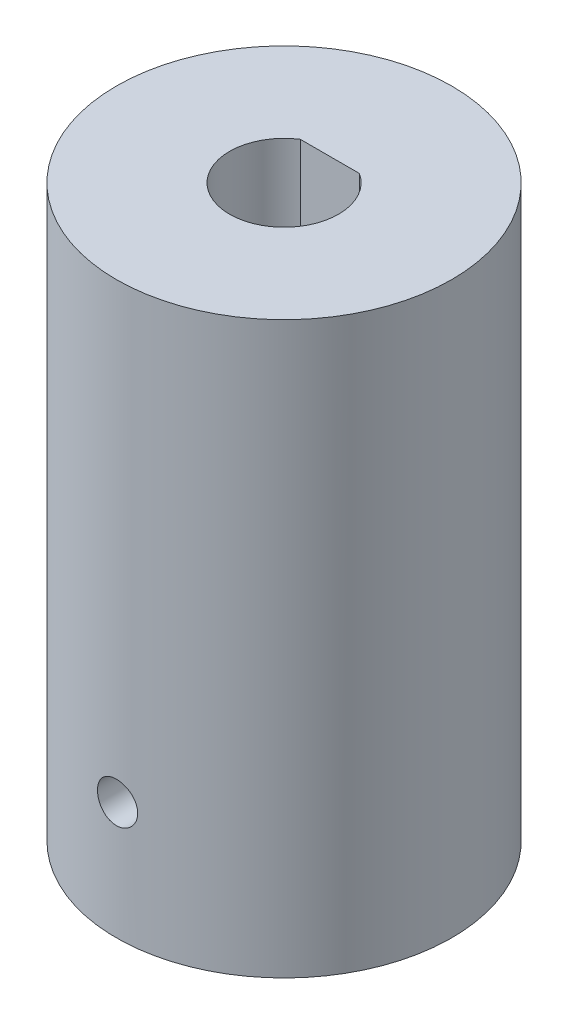
ISO-10303-21;
HEADER;
FILE_DESCRIPTION(('STEP AP214'),'2;1');
FILE_NAME('part.step','',(''),(''),'','','');
FILE_SCHEMA(('AUTOMOTIVE_DESIGN { 1 0 10303 214 1 1 1 1 }'));
ENDSEC;
DATA;
#1=APPLICATION_CONTEXT('core data for automotive mechanical design processes');
#2=APPLICATION_PROTOCOL_DEFINITION('international standard','automotive_design',2000,#1);
#3=PRODUCT_CONTEXT('',#1,'mechanical');
#4=PRODUCT('Part','Part','',(#3));
#5=PRODUCT_RELATED_PRODUCT_CATEGORY('part','',(#4));
#6=PRODUCT_DEFINITION_FORMATION('','',#4);
#7=PRODUCT_DEFINITION_CONTEXT('part definition',#1,'design');
#8=PRODUCT_DEFINITION('design','',#6,#7);
#9=PRODUCT_DEFINITION_SHAPE('','',#8);
#10=(LENGTH_UNIT() NAMED_UNIT(*) SI_UNIT(.MILLI.,.METRE.));
#11=(NAMED_UNIT(*) PLANE_ANGLE_UNIT() SI_UNIT($,.RADIAN.));
#12=(NAMED_UNIT(*) SI_UNIT($,.STERADIAN.) SOLID_ANGLE_UNIT());
#13=UNCERTAINTY_MEASURE_WITH_UNIT(LENGTH_MEASURE(1.E-05),#10,'distance_accuracy_value','');
#14=(GEOMETRIC_REPRESENTATION_CONTEXT(3) GLOBAL_UNCERTAINTY_ASSIGNED_CONTEXT((#13)) GLOBAL_UNIT_ASSIGNED_CONTEXT((#10,
#11,#12)) REPRESENTATION_CONTEXT('',''));
#15=CARTESIAN_POINT('',(0.,0.,0.));
#16=DIRECTION('',(0.,0.,1.));
#17=DIRECTION('',(1.,0.,0.));
#18=AXIS2_PLACEMENT_3D('',#15,#16,#17);
#19=CARTESIAN_POINT('',(0.,50.8,0.));
#20=DIRECTION('',(0.,-1.,0.));
#21=DIRECTION('',(0.,0.,-1.));
#22=AXIS2_PLACEMENT_3D('',#19,#20,#21);
#23=CYLINDRICAL_SURFACE('',#22,12.7);
#24=CARTESIAN_POINT('',(0.,50.8,0.));
#25=DIRECTION('',(0.,1.,0.));
#26=DIRECTION('',(0.,0.,1.));
#27=AXIS2_PLACEMENT_3D('',#24,#25,#26);
#28=CIRCLE('',#27,12.7);
#29=CARTESIAN_POINT('',(0.,50.8,12.7));
#30=VERTEX_POINT('',#29);
#31=EDGE_CURVE('E11',#30,#30,#28,.T.);
#32=ORIENTED_EDGE('',*,*,#31,.F.);
#33=EDGE_LOOP('',(#32));
#34=FACE_BOUND('',#33,.T.);
#35=CARTESIAN_POINT('',(1.524,16.51,12.6082284243267));
#36=CARTESIAN_POINT('',(1.5239963585177,16.4247275562753,12.6082296058594));
#37=CARTESIAN_POINT('',(1.5168189805614,16.3394011437783,12.6091028380521));
#38=CARTESIAN_POINT('',(1.48829937904496,16.171121017088,12.61250027713));
#39=CARTESIAN_POINT('',(1.4669421778142,16.088169908594,12.6150262296871));
#40=CARTESIAN_POINT('',(1.41069991984845,15.927101289999,12.6214389737461));
#41=CARTESIAN_POINT('',(1.37582383097192,15.8489806153428,12.6253248629579));
#42=CARTESIAN_POINT('',(1.29355259479434,15.6997160518127,12.6340185469841));
#43=CARTESIAN_POINT('',(1.24615966267703,15.6285709314835,12.6388261786309));
#44=CARTESIAN_POINT('',(1.1399374911646,15.494894196022,12.6488494827761));
#45=CARTESIAN_POINT('',(1.08105649803328,15.4324038344709,12.6540669354786));
#46=CARTESIAN_POINT('',(0.953640899089183,15.3181666111737,12.6643059685412));
#47=CARTESIAN_POINT('',(0.885105821887499,15.2664202743416,12.6693275393216));
#48=CARTESIAN_POINT('',(0.740069420781731,15.1749930012684,12.6786271203715));
#49=CARTESIAN_POINT('',(0.663544496555285,15.1353492488043,12.6829028221378));
#50=CARTESIAN_POINT('',(0.504863489774569,15.0694905821246,12.6902093791567));
#51=CARTESIAN_POINT('',(0.422707600651454,15.0432752068882,12.6932402771449));
#52=CARTESIAN_POINT('',(0.25551783134842,15.0051402938994,12.6977031960859));
#53=CARTESIAN_POINT('',(0.170499771290035,14.9931523080495,12.6991428701119));
#54=CARTESIAN_POINT('',(-0.000352804307632729,14.9836004115503,12.700287241798));
#55=CARTESIAN_POINT('',(-0.086187289991518,14.9860359754636,12.6999920026594));
#56=CARTESIAN_POINT('',(-0.255770719098907,15.0052070339005,12.6977060206035));
#57=CARTESIAN_POINT('',(-0.339528118284654,15.021868917326,12.6957240057244));
#58=CARTESIAN_POINT('',(-0.503049220006319,15.0689046610717,12.6902970182569));
#59=CARTESIAN_POINT('',(-0.582812851665644,15.0992787646443,12.6868520197157));
#60=CARTESIAN_POINT('',(-0.736311010615764,15.1729555462845,12.6788711575513));
#61=CARTESIAN_POINT('',(-0.810030027015897,15.2162902358913,12.6743325983856));
#62=CARTESIAN_POINT('',(-0.949177131460984,15.3146348006697,12.6646727131318));
#63=CARTESIAN_POINT('',(-1.01460486881358,15.3696451694191,12.6595513624111));
#64=CARTESIAN_POINT('',(-1.13574434330509,15.4901922095666,12.649261302661));
#65=CARTESIAN_POINT('',(-1.19139227750216,15.5557930089377,12.6440924985331));
#66=CARTESIAN_POINT('',(-1.2908970464718,15.6954380089492,12.6343220031406));
#67=CARTESIAN_POINT('',(-1.33475384931107,15.7694822324556,12.6297203134118));
#68=CARTESIAN_POINT('',(-1.40943420606194,15.9239673849949,12.6216050364049));
#69=CARTESIAN_POINT('',(-1.44025290388082,16.004410684159,12.618091854676));
#70=CARTESIAN_POINT('',(-1.48792697096448,16.1693821186266,12.6125593979759));
#71=CARTESIAN_POINT('',(-1.50478295872144,16.2539100728206,12.610540056834));
#72=CARTESIAN_POINT('',(-1.5239691578578,16.4240886129594,12.6082358967943));
#73=CARTESIAN_POINT('',(-1.52638904409552,16.5097289494276,12.6079403700802));
#74=CARTESIAN_POINT('',(-1.51687071812246,16.6801946206682,12.6090889956982));
#75=CARTESIAN_POINT('',(-1.50493278739154,16.7650199713852,12.6105331139253));
#76=CARTESIAN_POINT('',(-1.46711310306545,16.9311806580678,12.6149885507689));
#77=CARTESIAN_POINT('',(-1.4412745494946,17.0125259681791,12.6179950129896));
#78=CARTESIAN_POINT('',(-1.37643147010653,17.1697290757518,12.625232450945));
#79=CARTESIAN_POINT('',(-1.33742651619375,17.2455866946875,12.6294634664944));
#80=CARTESIAN_POINT('',(-1.24713645782578,17.3900674778471,12.6386989955156));
#81=CARTESIAN_POINT('',(-1.1957924122787,17.4586535697357,12.6437071793807));
#82=CARTESIAN_POINT('',(-1.08236521061047,17.58626663741,12.6539211254507));
#83=CARTESIAN_POINT('',(-1.02028167009359,17.6452932708902,12.6591268947227));
#84=CARTESIAN_POINT('',(-0.886746650515203,17.7524256315953,12.6691822280014));
#85=CARTESIAN_POINT('',(-0.81524779770426,17.8004725252278,12.6740297830064));
#86=CARTESIAN_POINT('',(-0.665142906140575,17.8838749303392,12.6827926395029));
#87=CARTESIAN_POINT('',(-0.586537000987363,17.9192306803262,12.6867079585139));
#88=CARTESIAN_POINT('',(-0.424646976317752,17.9761494704769,12.6931562458701));
#89=CARTESIAN_POINT('',(-0.341375070688768,17.9977468441012,12.6956926528935));
#90=CARTESIAN_POINT('',(-0.172354537175671,18.0266475857397,12.699111577317));
#91=CARTESIAN_POINT('',(-0.0866060119343203,18.0339515452801,12.6999941631595));
#92=CARTESIAN_POINT('',(0.0843584831778756,18.0340476728091,12.7000057428713));
#93=CARTESIAN_POINT('',(0.169574415566707,18.0269306906351,12.6991457149546));
#94=CARTESIAN_POINT('',(0.337589990196488,17.9985789609095,12.6957904784252));
#95=CARTESIAN_POINT('',(0.420389633229461,17.9773442179856,12.6932952703484));
#96=CARTESIAN_POINT('',(0.581212734439678,17.9213875683132,12.6869488713901));
#97=CARTESIAN_POINT('',(0.659237598843984,17.8866696548571,12.6830980820208));
#98=CARTESIAN_POINT('',(0.808367908546858,17.8047415966511,12.6744675361126));
#99=CARTESIAN_POINT('',(0.879473297841202,17.7575313508033,12.6696877720557));
#100=CARTESIAN_POINT('',(1.01321081799828,17.6516214495408,12.659697279603));
#101=CARTESIAN_POINT('',(1.07578919608141,17.5928541434945,12.6544841233454));
#102=CARTESIAN_POINT('',(1.19023247201904,17.4656378971266,12.6442341407212));
#103=CARTESIAN_POINT('',(1.24209482245048,17.3971866612333,12.6391973565176));
#104=CARTESIAN_POINT('',(1.33378993962203,17.2522677884254,12.6298512557424));
#105=CARTESIAN_POINT('',(1.37357915885757,17.1757724412373,12.6255445967856));
#106=CARTESIAN_POINT('',(1.43969133358462,17.0171781810946,12.6181775767384));
#107=CARTESIAN_POINT('',(1.46602905384423,16.9350855246315,12.6151158499293));
#108=CARTESIAN_POINT('',(1.49812761117409,16.7954657541345,12.611335063639));
#109=CARTESIAN_POINT('',(1.50781595790509,16.7388221220044,12.6101758113455));
#110=CARTESIAN_POINT('',(1.52075335630032,16.6247938104758,12.6086220965512));
#111=CARTESIAN_POINT('',(1.52400245160504,16.5674091361022,12.6082276288673));
#112=CARTESIAN_POINT('',(1.524,16.51,12.6082284243267));
#113=B_SPLINE_CURVE_WITH_KNOTS('',3,(#35,#36,#37,#38,#39,#40,#41,#42,#43,#44,#45,#46,#47,#48,
#49,#50,#51,#52,#53,#54,#55,#56,#57,#58,#59,#60,#61,#62,#63,#64,#65,#66,#67,#68,#69,#70,#71,#72,
#73,#74,#75,#76,#77,#78,#79,#80,#81,#82,#83,#84,#85,#86,#87,#88,#89,#90,#91,#92,#93,#94,#95,#96,
#97,#98,#99,#100,#101,#102,#103,#104,#105,#106,#107,#108,#109,#110,#111,#112),.UNSPECIFIED.,.T.,
.F.,(4,2,2,2,2,2,2,2,2,2,2,2,2,2,2,2,2,2,2,2,2,2,2,2,2,2,2,2,2,2,2,2,2,2,2,2,2,2,4),(0.,
0.255607623515365,0.511485667216422,0.767194261922623,1.02285763257488,1.27970053086943,
1.53655597461988,1.79419281370798,2.05182080705831,2.30820425945781,2.56457837209093,
2.81963391448613,3.07469398169789,3.33038930240478,3.58609543453005,3.84341240159693,
4.10073006553448,4.35814348423707,4.61554549994547,4.87134689475838,5.12714327475822,
5.38214925074834,5.63716351886379,5.89342103157793,6.14968771834411,6.40729696082001,
6.66490136172173,6.92186037693215,7.17880875779119,7.43414343434101,7.68947802719492,
7.94473705554361,8.1999981497131,8.45680048094896,8.71366378939257,8.97144287578116,
9.22893840473258,9.4010257949631,9.57311201890818),.UNSPECIFIED.);
#114=CARTESIAN_POINT('',(1.524,16.51,12.6082284243267));
#115=VERTEX_POINT('',#114);
#116=EDGE_CURVE('E101',#115,#115,#113,.T.);
#117=ORIENTED_EDGE('',*,*,#116,.T.);
#118=EDGE_LOOP('',(#117));
#119=FACE_BOUND('',#118,.T.);
#120=CARTESIAN_POINT('',(0.,18.034,-12.7));
#121=CARTESIAN_POINT('',(-0.0852749359307113,18.0339963607177,-12.6999988497589));
#122=CARTESIAN_POINT('',(-0.170603833204245,18.0268185773841,-12.6991320413807));
#123=CARTESIAN_POINT('',(-0.338889122224591,17.9982972194091,-12.6957575423544));
#124=CARTESIAN_POINT('',(-0.421842910231755,17.9769386758447,-12.6932481178334));
#125=CARTESIAN_POINT('',(-0.582917196032988,17.9206924915248,-12.6868712106836));
#126=CARTESIAN_POINT('',(-0.661040835696861,17.8858137549333,-12.6830046220177));
#127=CARTESIAN_POINT('',(-0.810310372178655,17.8035362825777,-12.6743439306287));
#128=CARTESIAN_POINT('',(-0.881457504104659,17.7561397684453,-12.6695499925304));
#129=CARTESIAN_POINT('',(-1.01513198819501,17.6499139701166,-12.6595429335645));
#130=CARTESIAN_POINT('',(-1.07761871918406,17.5910337332231,-12.6543280075699));
#131=CARTESIAN_POINT('',(-1.19184892967477,17.463621173837,-12.6440813613753));
#132=CARTESIAN_POINT('',(-1.24359187311848,17.3950883700185,-12.6390496503271));
#133=CARTESIAN_POINT('',(-1.33501558179939,17.2500539807484,-12.6297212668165));
#134=CARTESIAN_POINT('',(-1.37465854441665,17.1735284039133,-12.6254269159217));
#135=CARTESIAN_POINT('',(-1.44051557109192,17.0148459793288,-12.61808303631));
#136=CARTESIAN_POINT('',(-1.46673010537962,16.9326893288796,-12.6150334640049));
#137=CARTESIAN_POINT('',(-1.50486328463063,16.7654971474698,-12.6105415085459));
#138=CARTESIAN_POINT('',(-1.51685029617724,16.6804774195587,-12.6090914417892));
#139=CARTESIAN_POINT('',(-1.52639966611592,16.509621572327,-12.6079391066831));
#140=CARTESIAN_POINT('',(-1.52396256066847,16.4237854834698,-12.6082367733684));
#141=CARTESIAN_POINT('',(-1.50478904567963,16.2542088098895,-12.6105392424884));
#142=CARTESIAN_POINT('',(-1.4881277995693,16.1704595875505,-12.6125350712815));
#143=CARTESIAN_POINT('',(-1.44109615854394,16.0069545098667,-12.6179949868505));
#144=CARTESIAN_POINT('',(-1.41072550582714,15.9271987296491,-12.6214591012369));
#145=CARTESIAN_POINT('',(-1.3370559019553,15.7737101501345,-12.6294754816374));
#146=CARTESIAN_POINT('',(-1.29372413951594,15.6999932489964,-12.6340305033996));
#147=CARTESIAN_POINT('',(-1.1953858397009,15.5608491368548,-12.6437132945854));
#148=CARTESIAN_POINT('',(-1.14037881003363,15.4954222755895,-12.6488410881556));
#149=CARTESIAN_POINT('',(-1.01983415825587,15.3742790891429,-12.6591315680788));
#150=CARTESIAN_POINT('',(-0.954231721460175,15.3186272393126,-12.6642942687314));
#151=CARTESIAN_POINT('',(-0.814582043140869,15.2191153473318,-12.6740422565663));
#152=CARTESIAN_POINT('',(-0.740534784652663,15.1752553288703,-12.6786275425886));
#153=CARTESIAN_POINT('',(-0.586048768597525,15.1005726508951,-12.6867065981744));
#154=CARTESIAN_POINT('',(-0.505608121987521,15.0697538617881,-12.6902000436187));
#155=CARTESIAN_POINT('',(-0.340642459314908,15.0220788011717,-12.695698797177));
#156=CARTESIAN_POINT('',(-0.256117619560345,15.0052219275177,-12.6977041694677));
#157=CARTESIAN_POINT('',(-0.0859405933581027,14.9860323822072,-12.6999925070154));
#158=CARTESIAN_POINT('',(-0.000298561979482917,14.9836108595404,-12.7002860087626));
#159=CARTESIAN_POINT('',(0.170170890667576,14.9931265175571,-12.6991459414201));
#160=CARTESIAN_POINT('',(0.254998327862282,15.005063416938,-12.6977124061656));
#161=CARTESIAN_POINT('',(0.421169726075604,15.0428832817136,-12.6932859357389));
#162=CARTESIAN_POINT('',(0.502523427955469,15.0687240474294,-12.6902977200858));
#163=CARTESIAN_POINT('',(0.65974234202472,15.1335743573036,-12.6830965794911));
#164=CARTESIAN_POINT('',(0.735607381169124,15.172584316437,-12.6788836159569));
#165=CARTESIAN_POINT('',(0.880093326253843,15.2628818012784,-12.6696767260617));
#166=CARTESIAN_POINT('',(0.948677955130775,15.3142269980079,-12.6646791706999));
#167=CARTESIAN_POINT('',(1.07628753577319,15.4276556299754,-12.6544739503065));
#168=CARTESIAN_POINT('',(1.13531213868258,15.4897394569072,-12.6492662776162));
#169=CARTESIAN_POINT('',(1.24243995974886,15.6232736126373,-12.6391954218351));
#170=CARTESIAN_POINT('',(1.29048440521825,15.6947712597947,-12.6343341842304));
#171=CARTESIAN_POINT('',(1.37388251730101,15.8448730727384,-12.6255381216639));
#172=CARTESIAN_POINT('',(1.40923642132886,15.9234771055441,-12.6216032793715));
#173=CARTESIAN_POINT('',(1.46615402307425,16.0853681893185,-12.6151185713127));
#174=CARTESIAN_POINT('',(1.48775125440948,16.1686433100246,-12.6125653400022));
#175=CARTESIAN_POINT('',(1.51665062259066,16.3376706364984,-12.609123131949));
#176=CARTESIAN_POINT('',(1.52395336827249,16.4234227366079,-12.608234084325));
#177=CARTESIAN_POINT('',(1.52404589179509,16.5943852666557,-12.6082228539163));
#178=CARTESIAN_POINT('',(1.51692799825046,16.6795956606918,-12.6090894306883));
#179=CARTESIAN_POINT('',(1.48857639125421,16.8475999274882,-12.6124676857292));
#180=CARTESIAN_POINT('',(1.4673426727361,16.9303937993812,-12.6149793645885));
#181=CARTESIAN_POINT('',(1.41139031828837,17.0912051057555,-12.621361423449));
#182=CARTESIAN_POINT('',(1.37667576109834,17.1692239766957,-12.6252313924541));
#183=CARTESIAN_POINT('',(1.29475627575029,17.3183436955116,-12.6338946985882));
#184=CARTESIAN_POINT('',(1.24755123976398,17.3894444836573,-12.6386880436886));
#185=CARTESIAN_POINT('',(1.1416471434078,17.5231820935753,-12.6486948002274));
#186=CARTESIAN_POINT('',(1.08287923596516,17.5857642204593,-12.6539106119324));
#187=CARTESIAN_POINT('',(0.955660234138993,17.7002147796195,-12.664153232383));
#188=CARTESIAN_POINT('',(0.887206852779092,17.7520806743956,-12.6691799961339));
#189=CARTESIAN_POINT('',(0.742286158122894,17.8437796936234,-12.6784974628337));
#190=CARTESIAN_POINT('',(0.66579152318908,17.8835698846669,-12.6827855165835));
#191=CARTESIAN_POINT('',(0.507198757856138,17.9496840723368,-12.6901152608021));
#192=CARTESIAN_POINT('',(0.42510687869597,17.9760228216596,-12.6931583159752));
#193=CARTESIAN_POINT('',(0.285484367428242,18.0081242175318,-12.6969148309608));
#194=CARTESIAN_POINT('',(0.228837017434771,18.0178138418143,-12.6980661859519));
#195=CARTESIAN_POINT('',(0.114801261732396,18.0307529368934,-12.6996091551736));
#196=CARTESIAN_POINT('',(0.0574128609188415,18.0340024502112,-12.7000007744202));
#197=CARTESIAN_POINT('',(0.,18.034,-12.7));
#198=B_SPLINE_CURVE_WITH_KNOTS('',3,(#120,#121,#122,#123,#124,#125,#126,#127,#128,#129,#130,
#131,#132,#133,#134,#135,#136,#137,#138,#139,#140,#141,#142,#143,#144,#145,#146,#147,#148,#149,
#150,#151,#152,#153,#154,#155,#156,#157,#158,#159,#160,#161,#162,#163,#164,#165,#166,#167,#168,
#169,#170,#171,#172,#173,#174,#175,#176,#177,#178,#179,#180,#181,#182,#183,#184,#185,#186,#187,
#188,#189,#190,#191,#192,#193,#194,#195,#196,#197),.UNSPECIFIED.,.T.,.F.,(4,2,2,2,2,2,2,2,2,2,2,
2,2,2,2,2,2,2,2,2,2,2,2,2,2,2,2,2,2,2,2,2,2,2,2,2,2,2,4),(0.,0.255615110285729,
0.511500472595806,0.767217598787844,1.0228893712438,1.27972247075506,1.5365683817968,
1.7942087026417,2.0518400009555,2.30822824278385,2.56460695443588,2.81963923199425,
3.07467630556725,3.33036455444952,3.58606358665585,3.84339055877281,4.10071804783681,
4.35812185368693,4.6155145577389,4.87132133493107,5.12712310057748,5.38215282499336,
5.63719058641247,5.89344476267066,6.14970828782611,6.40731294514893,6.664912782956,
6.92188226118563,7.17884079424063,7.43415934141684,7.68947798023267,7.94471943038653,
8.19996308407057,8.45677518202322,8.71364802108206,8.97142371441645,9.22891608514716,
9.40101462163783,9.57311202183422),.UNSPECIFIED.);
#199=CARTESIAN_POINT('',(0.,18.034,-12.7));
#200=VERTEX_POINT('',#199);
#201=EDGE_CURVE('E109',#200,#200,#198,.T.);
#202=ORIENTED_EDGE('',*,*,#201,.T.);
#203=EDGE_LOOP('',(#202));
#204=FACE_BOUND('',#203,.T.);
#205=CARTESIAN_POINT('',(0.,45.1739,-12.7));
#206=CARTESIAN_POINT('',(-0.111264734653533,45.1738954611363,-12.6999981615941));
#207=CARTESIAN_POINT('',(-0.222592469621449,45.1645552637295,-12.6985225281512));
#208=CARTESIAN_POINT('',(-0.442131833547935,45.1274531893068,-12.6927779832692));
#209=CARTESIAN_POINT('',(-0.550340394749006,45.0996737815042,-12.688506413692));
#210=CARTESIAN_POINT('',(-0.760432830596594,45.026547455329,-12.6776496520855));
#211=CARTESIAN_POINT('',(-0.862321574547347,44.9812142619021,-12.6710662679902));
#212=CARTESIAN_POINT('',(-1.05703161972714,44.8743017450774,-12.6563118693623));
#213=CARTESIAN_POINT('',(-1.14985408714446,44.8127245149186,-12.6481410594243));
#214=CARTESIAN_POINT('',(-1.32460260102139,44.6745128669852,-12.6310413785007));
#215=CARTESIAN_POINT('',(-1.40644014006819,44.5977671891146,-12.6221072010465));
#216=CARTESIAN_POINT('',(-1.55613172796302,44.4316366332505,-12.6045288794584));
#217=CARTESIAN_POINT('',(-1.623984941374,44.3422510006717,-12.5958847526782));
#218=CARTESIAN_POINT('',(-1.74413051132213,44.1527776852123,-12.5798138186253));
#219=CARTESIAN_POINT('',(-1.79633645571075,44.0526345758545,-12.5723938695149));
#220=CARTESIAN_POINT('',(-1.88315318122086,43.844864969494,-12.5596843578785));
#221=CARTESIAN_POINT('',(-1.91776501420816,43.737238920297,-12.5543946679988));
#222=CARTESIAN_POINT('',(-1.96813448945543,43.5184924795053,-12.5465970451133));
#223=CARTESIAN_POINT('',(-1.98404419387365,43.4074079165008,-12.5440666890521));
#224=CARTESIAN_POINT('',(-1.99702903046143,43.184119236708,-12.5420062601965));
#225=CARTESIAN_POINT('',(-1.99410534615934,43.0719151907127,-12.5424759988701));
#226=CARTESIAN_POINT('',(-1.96963049871561,42.8506513844667,-12.5463421929772));
#227=CARTESIAN_POINT('',(-1.9482492879266,42.7415722910346,-12.5497119449345));
#228=CARTESIAN_POINT('',(-1.88773263813374,42.5285692305328,-12.5589567311012));
#229=CARTESIAN_POINT('',(-1.84859665316986,42.4246454220973,-12.5648318423502));
#230=CARTESIAN_POINT('',(-1.75350644162036,42.2243892463396,-12.5784546022662));
#231=CARTESIAN_POINT('',(-1.6974808054438,42.1280913484232,-12.586210173737));
#232=CARTESIAN_POINT('',(-1.57025244519833,41.9461990805868,-12.6027143648226));
#233=CARTESIAN_POINT('',(-1.49904863152467,41.8606054798028,-12.61146305571));
#234=CARTESIAN_POINT('',(-1.34255505177202,41.7015670048239,-12.629085451158));
#235=CARTESIAN_POINT('',(-1.25711928824635,41.6282657510462,-12.637959474062));
#236=CARTESIAN_POINT('',(-1.0750830499754,41.4970192547703,-12.6547436685061));
#237=CARTESIAN_POINT('',(-0.978482517516258,41.4390740916571,-12.6626538350634));
#238=CARTESIAN_POINT('',(-0.776730089381289,41.3401749328028,-12.676628488877));
#239=CARTESIAN_POINT('',(-0.671572347231256,41.2992326723828,-12.6826917006074));
#240=CARTESIAN_POINT('',(-0.455757138509096,41.2356298044811,-12.6922788064507));
#241=CARTESIAN_POINT('',(-0.345100080279145,41.2129678417744,-12.695802888802));
#242=CARTESIAN_POINT('',(-0.122666248694454,41.1867613502506,-12.6998895816796));
#243=CARTESIAN_POINT('',(-0.0109132656040355,41.1830194906741,-12.7004827591342));
#244=CARTESIAN_POINT('',(0.211623700367724,41.1942347025456,-12.6987242230026));
#245=CARTESIAN_POINT('',(0.322407716074517,41.2091911380666,-12.6963726095683));
#246=CARTESIAN_POINT('',(0.539259465772362,41.2572142704732,-12.6890076301094));
#247=CARTESIAN_POINT('',(0.645349155616784,41.2901841939113,-12.6840084916875));
#248=CARTESIAN_POINT('',(0.850495129908783,41.3731959022268,-12.6719069892576));
#249=CARTESIAN_POINT('',(0.949551056839788,41.4232385541383,-12.6648045184348));
#250=CARTESIAN_POINT('',(1.13868108155311,41.5394336511867,-12.6492091357191));
#251=CARTESIAN_POINT('',(1.228677866823,41.6057104931794,-12.6407056615266));
#252=CARTESIAN_POINT('',(1.39634204662003,41.7523202707658,-12.6232859166232));
#253=CARTESIAN_POINT('',(1.4740086515401,41.8326541058572,-12.6143696195228));
#254=CARTESIAN_POINT('',(1.61553131857782,42.0059786808438,-12.5970314412209));
#255=CARTESIAN_POINT('',(1.67925466782684,42.0990783910525,-12.5886148236836));
#256=CARTESIAN_POINT('',(1.79015769339579,42.2947764698832,-12.5733242486554));
#257=CARTESIAN_POINT('',(1.83733784944822,42.3973745629545,-12.5664502464327));
#258=CARTESIAN_POINT('',(1.91361245103288,42.6087713555129,-12.5550618853187));
#259=CARTESIAN_POINT('',(1.94277519130098,42.7175449125884,-12.5505386264617));
#260=CARTESIAN_POINT('',(1.98240354603241,42.9385227609009,-12.5443407697368));
#261=CARTESIAN_POINT('',(1.99287058664215,43.0507267897901,-12.5426659545842));
#262=CARTESIAN_POINT('',(1.99477410060141,43.2740567773568,-12.5423632437479));
#263=CARTESIAN_POINT('',(1.98641932881383,43.3851809672983,-12.5437019249072));
#264=CARTESIAN_POINT('',(1.95136537930417,43.604422425733,-12.5492024828482));
#265=CARTESIAN_POINT('',(1.92466624261724,43.7125397009519,-12.5533643533147));
#266=CARTESIAN_POINT('',(1.85375781272552,43.9226310741939,-12.564030250376));
#267=CARTESIAN_POINT('',(1.80956449553288,44.0246106796343,-12.5705321395313));
#268=CARTESIAN_POINT('',(1.70494320824158,44.2197418458349,-12.5851478476167));
#269=CARTESIAN_POINT('',(1.64451458329848,44.3128930503001,-12.5932617315625));
#270=CARTESIAN_POINT('',(1.50838501339106,44.4887814433156,-12.6102940567383));
#271=CARTESIAN_POINT('',(1.43252986211743,44.5713985647654,-12.6192200743172));
#272=CARTESIAN_POINT('',(1.26802629967985,44.7228040964523,-12.6368088378146));
#273=CARTESIAN_POINT('',(1.17937492875583,44.7915892985397,-12.6454715222616));
#274=CARTESIAN_POINT('',(0.991159898347474,44.9137549145522,-12.6616179744992));
#275=CARTESIAN_POINT('',(0.891533318385668,44.9670393708363,-12.6690942737165));
#276=CARTESIAN_POINT('',(0.684671030388775,45.0560370317099,-12.6819526463405));
#277=CARTESIAN_POINT('',(0.577443208695725,45.0917681513262,-12.6873368537685));
#278=CARTESIAN_POINT('',(0.391466638544236,45.1366810812955,-12.6941972993127));
#279=CARTESIAN_POINT('',(0.313856876216662,45.1506164326571,-12.6963619520299));
#280=CARTESIAN_POINT('',(0.15750859034005,45.1692274325659,-12.6992639429375));
#281=CARTESIAN_POINT('',(0.0787700829204795,45.1739032132973,-12.700001301503));
#282=CARTESIAN_POINT('',(0.,45.1739,-12.7));
#283=B_SPLINE_CURVE_WITH_KNOTS('',3,(#205,#206,#207,#208,#209,#210,#211,#212,#213,#214,#215,
#216,#217,#218,#219,#220,#221,#222,#223,#224,#225,#226,#227,#228,#229,#230,#231,#232,#233,#234,
#235,#236,#237,#238,#239,#240,#241,#242,#243,#244,#245,#246,#247,#248,#249,#250,#251,#252,#253,
#254,#255,#256,#257,#258,#259,#260,#261,#262,#263,#264,#265,#266,#267,#268,#269,#270,#271,#272,
#273,#274,#275,#276,#277,#278,#279,#280,#281,#282),.UNSPECIFIED.,.T.,.F.,(4,2,2,2,2,2,2,2,2,2,2,
2,2,2,2,2,2,2,2,2,2,2,2,2,2,2,2,2,2,2,2,2,2,2,2,2,2,2,4),(0.,0.333506332099171,
0.667330195075987,1.00089357333717,1.334413988933,1.67047818701713,2.00656245608303,
2.34446993152608,2.68235720275829,3.01747776917435,3.35257727613962,3.68462378662448,
4.0166805082455,4.35016134216255,4.68366612393114,5.02083060571114,5.35799683046859,
5.69539538050811,6.03276891492695,6.36661638346795,6.70045249819784,7.03251253985473,
7.36458944760661,7.69929524001801,8.03402245786966,8.37180900052226,8.70958574696546,
9.04607417199253,9.38253692789425,9.71528633159346,10.0480349909562,10.3804804764675,
10.712939373044,11.0489011791901,11.3849408180494,11.7230184833212,12.0607503841979,
12.296860204111,12.5329666534344),.UNSPECIFIED.);
#284=CARTESIAN_POINT('',(0.,45.1739,-12.7));
#285=VERTEX_POINT('',#284);
#286=EDGE_CURVE('E89',#285,#285,#283,.T.);
#287=ORIENTED_EDGE('',*,*,#286,.T.);
#288=EDGE_LOOP('',(#287));
#289=FACE_BOUND('',#288,.T.);
#290=CARTESIAN_POINT('',(0.,7.62,0.));
#291=DIRECTION('',(0.,-1.,0.));
#292=DIRECTION('',(0.,0.,-1.));
#293=AXIS2_PLACEMENT_3D('',#290,#291,#292);
#294=CIRCLE('',#293,12.7);
#295=CARTESIAN_POINT('',(0.,7.62,-12.7));
#296=VERTEX_POINT('',#295);
#297=EDGE_CURVE('E163',#296,#296,#294,.T.);
#298=ORIENTED_EDGE('',*,*,#297,.F.);
#299=EDGE_LOOP('',(#298));
#300=FACE_BOUND('',#299,.T.);
#301=ADVANCED_FACE('F42',(#34,#119,#204,#289,#300),#23,.T.);
#302=CARTESIAN_POINT('',(0.,33.02,0.));
#303=DIRECTION('',(0.,-1.,0.));
#304=DIRECTION('',(0.,0.,-1.));
#305=AXIS2_PLACEMENT_3D('',#302,#303,#304);
#306=CYLINDRICAL_SURFACE('',#305,6.35);
#307=CARTESIAN_POINT('',(0.,33.02,0.));
#308=DIRECTION('',(0.,-1.,0.));
#309=DIRECTION('',(0.,0.,-1.));
#310=AXIS2_PLACEMENT_3D('',#307,#308,#309);
#311=CIRCLE('',#310,6.35);
#312=CARTESIAN_POINT('',(0.,33.02,-6.35));
#313=VERTEX_POINT('',#312);
#314=EDGE_CURVE('E52',#313,#313,#311,.T.);
#315=ORIENTED_EDGE('',*,*,#314,.F.);
#316=EDGE_LOOP('',(#315));
#317=FACE_BOUND('',#316,.T.);
#318=CARTESIAN_POINT('',(1.524,16.51,6.16440783855189));
#319=CARTESIAN_POINT('',(1.5239974226084,16.5942702474822,6.16440950040394));
#320=CARTESIAN_POINT('',(1.51698656000359,16.6785697933255,6.16615471261443));
#321=CARTESIAN_POINT('',(1.48916833167698,16.8447559231819,6.17293085958514));
#322=CARTESIAN_POINT('',(1.46835229380644,16.926640956652,6.17796385964136));
#323=CARTESIAN_POINT('',(1.41362982625431,17.0855702460646,6.19071347767739));
#324=CARTESIAN_POINT('',(1.37973944396961,17.1626203021705,6.1984268046874));
#325=CARTESIAN_POINT('',(1.2998782830905,17.3099473681779,6.21566393275977));
#326=CARTESIAN_POINT('',(1.25390724121996,17.3802242304241,6.22518777327775));
#327=CARTESIAN_POINT('',(1.15019374819893,17.5134365579896,6.24518908868979));
#328=CARTESIAN_POINT('',(1.092251493866,17.5762143552427,6.25568081255475));
#329=CARTESIAN_POINT('',(0.966671047684626,17.6912602203726,6.27631176518938));
#330=CARTESIAN_POINT('',(0.899032003464784,17.7435273633658,6.28645096287369));
#331=CARTESIAN_POINT('',(0.75490544984188,17.8367062278147,6.30539129866511));
#332=CARTESIAN_POINT('',(0.678315814514744,17.877464129963,6.31417366017607));
#333=CARTESIAN_POINT('',(0.519127050867771,17.9454690809575,6.32924876369161));
#334=CARTESIAN_POINT('',(0.43652873950995,17.9727179626178,6.33554184340201));
#335=CARTESIAN_POINT('',(0.269309673621844,18.0124293824283,6.34482860598793));
#336=CARTESIAN_POINT('',(0.184755803990826,18.0251593848178,6.34788189562787));
#337=CARTESIAN_POINT('',(0.0146611715797351,18.0363101400034,6.35055237285706));
#338=CARTESIAN_POINT('',(-0.0708794546941016,18.0347328488895,6.35017003016526));
#339=CARTESIAN_POINT('',(-0.238668152171909,18.0175084400012,6.34605708905427));
#340=CARTESIAN_POINT('',(-0.32094778031149,18.0021498812424,6.34239516316153));
#341=CARTESIAN_POINT('',(-0.481726197241271,17.9582613971149,6.33221388355049));
#342=CARTESIAN_POINT('',(-0.560224793800639,17.9297308028478,6.3256943847206));
#343=CARTESIAN_POINT('',(-0.711986642043756,17.8600674889641,6.31042363380006));
#344=CARTESIAN_POINT('',(-0.785199804958172,17.8188298660696,6.30165390970025));
#345=CARTESIAN_POINT('',(-0.923769424060553,17.7250021756975,6.28283750544897));
#346=CARTESIAN_POINT('',(-0.989124607626297,17.6724102732072,6.27279061899799));
#347=CARTESIAN_POINT('',(-1.11184271445029,17.555811776249,6.25222191493314));
#348=CARTESIAN_POINT('',(-1.16896518612279,17.4915528419862,6.24169450285585));
#349=CARTESIAN_POINT('',(-1.27167413883743,17.3542575768315,6.22158274225918));
#350=CARTESIAN_POINT('',(-1.31726016375621,17.2812208990572,6.21199843103689));
#351=CARTESIAN_POINT('',(-1.39574009047391,17.1279996498183,6.1948395913499));
#352=CARTESIAN_POINT('',(-1.42858029819518,17.047786554053,6.18727360638079));
#353=CARTESIAN_POINT('',(-1.48023744752889,16.8827535732739,6.17512014807819));
#354=CARTESIAN_POINT('',(-1.49905712553295,16.7979345906615,6.17053209356349));
#355=CARTESIAN_POINT('',(-1.52174879919161,16.6283165629291,6.16497485131075));
#356=CARTESIAN_POINT('',(-1.52597451131117,16.5435675871708,6.16392004697435));
#357=CARTESIAN_POINT('',(-1.52032311332554,16.3745757374141,6.16531637760675));
#358=CARTESIAN_POINT('',(-1.5104471892682,16.2903328214509,6.16776721772597));
#359=CARTESIAN_POINT('',(-1.47718196830091,16.1260302740282,6.17581703717015));
#360=CARTESIAN_POINT('',(-1.45399486434277,16.0459271786333,6.18136887978174));
#361=CARTESIAN_POINT('',(-1.39498788814311,15.890744027102,6.19495114207963));
#362=CARTESIAN_POINT('',(-1.35916661162342,15.8156645304386,6.20298183727603));
#363=CARTESIAN_POINT('',(-1.27515489787524,15.6711503938801,6.22079981472444));
#364=CARTESIAN_POINT('',(-1.22675083994173,15.6018436380049,6.23061645539051));
#365=CARTESIAN_POINT('',(-1.11922078218074,15.472206427182,6.25082645590849));
#366=CARTESIAN_POINT('',(-1.0600931646063,15.4118773290994,6.26121990261244));
#367=CARTESIAN_POINT('',(-0.931178531404211,15.3004951751185,6.28169996592795));
#368=CARTESIAN_POINT('',(-0.861178770141203,15.2496856519572,6.2917741398818));
#369=CARTESIAN_POINT('',(-0.713433989978142,15.1605445007528,6.31023342471778));
#370=CARTESIAN_POINT('',(-0.635689365069336,15.1222122383981,6.31861862145484));
#371=CARTESIAN_POINT('',(-0.475186340726963,15.0594326815443,6.33270366442953));
#372=CARTESIAN_POINT('',(-0.392467455873028,15.034888741175,6.3384221529822));
#373=CARTESIAN_POINT('',(-0.223925138443576,15.0000879472384,6.34661076668623));
#374=CARTESIAN_POINT('',(-0.13810225788229,14.9898285660002,6.3490814665336));
#375=CARTESIAN_POINT('',(0.0319162849292627,14.9840208991642,6.35047478545375));
#376=CARTESIAN_POINT('',(0.116099106684779,14.9881118799817,6.34948440999602));
#377=CARTESIAN_POINT('',(0.282540246757971,15.0100690212129,6.34425761771568));
#378=CARTESIAN_POINT('',(0.364798614254837,15.0279348292155,6.34002128393673));
#379=CARTESIAN_POINT('',(0.524710830881249,15.0767475071589,6.32878975048686));
#380=CARTESIAN_POINT('',(0.602384134411665,15.1076337772763,6.3218073415686));
#381=CARTESIAN_POINT('',(0.751489035088981,15.1815547240271,6.30582218436173));
#382=CARTESIAN_POINT('',(0.822919900346195,15.2245908226617,6.29681919961266));
#383=CARTESIAN_POINT('',(0.959239641862087,15.3227153409341,6.27751616770254));
#384=CARTESIAN_POINT('',(1.02394667764628,15.3780515759431,6.26719163338099));
#385=CARTESIAN_POINT('',(1.14327915394824,15.4987181061742,6.24652612750739));
#386=CARTESIAN_POINT('',(1.19790208278791,15.5640508838739,6.23618515250556));
#387=CARTESIAN_POINT('',(1.29641338475408,15.7041796122513,6.21646080245968));
#388=CARTESIAN_POINT('',(1.34010560854388,15.7791163312892,6.20709647443792));
#389=CARTESIAN_POINT('',(1.41420632018711,15.9354834180972,6.19063581119769));
#390=CARTESIAN_POINT('',(1.44462501090695,16.0169087411803,6.1835377351266));
#391=CARTESIAN_POINT('',(1.48648133683619,16.1668931695728,6.17359146696688));
#392=CARTESIAN_POINT('',(1.50052144248847,16.234699980728,6.1701724672735));
#393=CARTESIAN_POINT('',(1.51928149886027,16.3716646780313,6.16558005121491));
#394=CARTESIAN_POINT('',(1.52400211578341,16.4408224672479,6.16440647433584));
#395=CARTESIAN_POINT('',(1.524,16.51,6.16440783855189));
#396=B_SPLINE_CURVE_WITH_KNOTS('',3,(#318,#319,#320,#321,#322,#323,#324,#325,#326,#327,#328,
#329,#330,#331,#332,#333,#334,#335,#336,#337,#338,#339,#340,#341,#342,#343,#344,#345,#346,#347,
#348,#349,#350,#351,#352,#353,#354,#355,#356,#357,#358,#359,#360,#361,#362,#363,#364,#365,#366,
#367,#368,#369,#370,#371,#372,#373,#374,#375,#376,#377,#378,#379,#380,#381,#382,#383,#384,#385,
#386,#387,#388,#389,#390,#391,#392,#393,#394,#395),.UNSPECIFIED.,.T.,.F.,(4,2,2,2,2,2,2,2,2,2,2,
2,2,2,2,2,2,2,2,2,2,2,2,2,2,2,2,2,2,2,2,2,2,2,2,2,2,2,4),(0.,0.25255687979223,0.505272561481761,
0.757679042806294,1.01009102533009,1.26711668442575,1.52416495057045,1.78450154029282,
2.04480279960041,2.30022719270922,2.55561666477847,2.80578032456845,3.055956689494,
3.30825638536078,3.56059688700325,3.81924137581342,4.07789608920778,4.33762890271072,
4.59731101078112,4.85065321963541,5.10397412186399,5.35354529103673,5.60314420859164,
5.85729411521513,6.11148239461499,6.37148048144858,6.63146534859033,6.88960442202497,
7.14769781161587,7.39935034900731,7.65099644840901,7.9014840467613,8.15200097404141,
8.40811555714191,8.66429384564129,8.92478391790525,9.18507340700214,9.39241243131086,
9.59973663345345),.UNSPECIFIED.);
#397=CARTESIAN_POINT('',(1.524,16.51,6.16440783855189));
#398=VERTEX_POINT('',#397);
#399=EDGE_CURVE('E77',#398,#398,#396,.T.);
#400=ORIENTED_EDGE('',*,*,#399,.T.);
#401=EDGE_LOOP('',(#400));
#402=FACE_BOUND('',#401,.T.);
#403=CARTESIAN_POINT('',(0.,18.034,-6.35));
#404=CARTESIAN_POINT('',(0.0843096759465879,18.0339974477687,-6.34999851232037));
#405=CARTESIAN_POINT('',(0.168648593831458,18.0269802476001,-6.34830407425085));
#406=CARTESIAN_POINT('',(0.334916419813461,17.9991345682855,-6.34170862450415));
#407=CARTESIAN_POINT('',(0.416843811072851,17.9782975825787,-6.33680563787795));
#408=CARTESIAN_POINT('',(0.57586290451472,17.9235138940718,-6.32433701897638));
#409=CARTESIAN_POINT('',(0.652960047010097,17.8895822599523,-6.31677444810459));
#410=CARTESIAN_POINT('',(0.800366790829195,17.8096237982855,-6.29979565247942));
#411=CARTESIAN_POINT('',(0.870676295093839,17.7635967978168,-6.29037940122539));
#412=CARTESIAN_POINT('',(1.00385505804138,17.6598253973852,-6.27051760955203));
#413=CARTESIAN_POINT('',(1.06657623667045,17.6018937872269,-6.26005720068262));
#414=CARTESIAN_POINT('',(1.18151189052466,17.4763588145153,-6.23938677799982));
#415=CARTESIAN_POINT('',(1.23372526749236,17.4087544422436,-6.22917679045786));
#416=CARTESIAN_POINT('',(1.32684516725952,17.2646615168268,-6.21001448829728));
#417=CARTESIAN_POINT('',(1.36758871540181,17.1880648954491,-6.20108111146972));
#418=CARTESIAN_POINT('',(1.43556524137227,17.0288611237562,-6.1856992573005));
#419=CARTESIAN_POINT('',(1.46280019438071,16.9462548541776,-6.17925041670931));
#420=CARTESIAN_POINT('',(1.50248649519159,16.7789979007788,-6.16972018168062));
#421=CARTESIAN_POINT('',(1.51520277299618,16.6944135902551,-6.16657852524792));
#422=CARTESIAN_POINT('',(1.52631550910695,16.5242583511291,-6.16383779268313));
#423=CARTESIAN_POINT('',(1.52471410414646,16.4386875716484,-6.16423818794447));
#424=CARTESIAN_POINT('',(1.50744891337591,16.2709982092662,-6.16848201827821));
#425=CARTESIAN_POINT('',(1.49209812527441,16.1888451608839,-6.17224881475293));
#426=CARTESIAN_POINT('',(1.44826807951701,16.0283157631427,-6.18267921397902));
#427=CARTESIAN_POINT('',(1.41978795224992,15.9499396643269,-6.18934300860907));
#428=CARTESIAN_POINT('',(1.35023413585743,15.7983362071332,-6.20488861809656));
#429=CARTESIAN_POINT('',(1.30904461709455,15.7251641539183,-6.21379068774495));
#430=CARTESIAN_POINT('',(1.21532237989843,15.5866569136329,-6.23279805235033));
#431=CARTESIAN_POINT('',(1.16278782094065,15.5213230008352,-6.24290354242074));
#432=CARTESIAN_POINT('',(1.04623358905694,15.3985500662781,-6.26350386907443));
#433=CARTESIAN_POINT('',(0.981949087100734,15.3413627136764,-6.27400197003084));
#434=CARTESIAN_POINT('',(0.844578409695234,15.2385345623688,-6.29396514102267));
#435=CARTESIAN_POINT('',(0.771492005309275,15.1928940640914,-6.30343018417614));
#436=CARTESIAN_POINT('',(0.618250466410391,15.1143730119287,-6.32030206381155));
#437=CARTESIAN_POINT('',(0.538075015775956,15.0815306922312,-6.32770271454735));
#438=CARTESIAN_POINT('',(0.373124783887968,15.0298581398433,-6.33956672008705));
#439=CARTESIAN_POINT('',(0.288350814400933,15.0110254426456,-6.34403059149946));
#440=CARTESIAN_POINT('',(0.118763999023046,14.9882849511568,-6.34944259916959));
#441=CARTESIAN_POINT('',(0.0339996681168642,14.9840340946295,-6.35047153224228));
#442=CARTESIAN_POINT('',(-0.135028625846007,14.9896407175603,-6.34912661690925));
#443=CARTESIAN_POINT('',(-0.219292629620594,14.9994970326895,-6.34675304932728));
#444=CARTESIAN_POINT('',(-0.383754670695294,15.0327547850863,-6.33892135287708));
#445=CARTESIAN_POINT('',(-0.463992254290145,15.0559714676635,-6.33350532079064));
#446=CARTESIAN_POINT('',(-0.619431476468454,15.1150818813812,-6.32019741879553));
#447=CARTESIAN_POINT('',(-0.694632629853868,15.1509768318328,-6.31230531076256));
#448=CARTESIAN_POINT('',(-0.83924724705751,15.2351062295478,-6.29472503559956));
#449=CARTESIAN_POINT('',(-0.908543657841058,15.2835359641978,-6.28500918144712));
#450=CARTESIAN_POINT('',(-1.03814831281084,15.3911081199386,-6.26490676947191));
#451=CARTESIAN_POINT('',(-1.09845513137743,15.4502522368884,-6.25452010564194));
#452=CARTESIAN_POINT('',(-1.20976366525311,15.5791615422546,-6.23395970086435));
#453=CARTESIAN_POINT('',(-1.26052566816141,15.6491356420202,-6.22379599858735));
#454=CARTESIAN_POINT('',(-1.34958338578555,15.7968139373691,-6.20509497086679));
#455=CARTESIAN_POINT('',(-1.38787965869171,15.8745177866263,-6.19655757260773));
#456=CARTESIAN_POINT('',(-1.4506396870739,16.0350263568862,-6.18216642774506));
#457=CARTESIAN_POINT('',(-1.4751850322891,16.1177976873652,-6.17629689173133));
#458=CARTESIAN_POINT('',(-1.50997097185163,16.2864526620196,-6.16788569191901));
#459=CARTESIAN_POINT('',(-1.52021440571923,16.3723356849205,-6.16534336753773));
#460=CARTESIAN_POINT('',(-1.52596629756063,16.542344715737,-6.16392194785207));
#461=CARTESIAN_POINT('',(-1.52185678148815,16.6264572201325,-6.16494787495778));
#462=CARTESIAN_POINT('',(-1.499886995782,16.7927526802271,-6.17032936423131));
#463=CARTESIAN_POINT('',(-1.48202696177264,16.874935668965,-6.17468486934457));
#464=CARTESIAN_POINT('',(-1.43326404382182,17.0346611566941,-6.18618396880768));
#465=CARTESIAN_POINT('',(-1.40242748239167,17.1122249944724,-6.19331337209277));
#466=CARTESIAN_POINT('',(-1.3286403377894,17.261131042253,-6.20956002752742));
#467=CARTESIAN_POINT('',(-1.28568820806907,17.3324724564419,-6.21867753342388));
#468=CARTESIAN_POINT('',(-1.18766847915898,17.4687671960607,-6.23814821736793));
#469=CARTESIAN_POINT('',(-1.13233336133341,17.5335246601341,-6.24852591783443));
#470=CARTESIAN_POINT('',(-1.01164681984804,17.6529593539304,-6.26919547942238));
#471=CARTESIAN_POINT('',(-0.946293047081107,17.7076342129108,-6.27948731981363));
#472=CARTESIAN_POINT('',(-0.806136563391109,17.8062175038538,-6.29902577121867));
#473=CARTESIAN_POINT('',(-0.73119698494576,17.8499355499645,-6.30825257022192));
#474=CARTESIAN_POINT('',(-0.574820403969121,17.9240838026359,-6.32441613501757));
#475=CARTESIAN_POINT('',(-0.49338838263514,17.9545240824429,-6.33135463586102));
#476=CARTESIAN_POINT('',(-0.343350609052941,17.99642762157,-6.34106224299604));
#477=CARTESIAN_POINT('',(-0.275494529664359,18.0104880408191,-6.34439165203863));
#478=CARTESIAN_POINT('',(-0.138432147558951,18.0292749806728,-6.34886107159586));
#479=CARTESIAN_POINT('',(-0.069225931101215,18.0340020956146,-6.35000122152062));
#480=CARTESIAN_POINT('',(0.,18.034,-6.35));
#481=B_SPLINE_CURVE_WITH_KNOTS('',3,(#403,#404,#405,#406,#407,#408,#409,#410,#411,#412,#413,
#414,#415,#416,#417,#418,#419,#420,#421,#422,#423,#424,#425,#426,#427,#428,#429,#430,#431,#432,
#433,#434,#435,#436,#437,#438,#439,#440,#441,#442,#443,#444,#445,#446,#447,#448,#449,#450,#451,
#452,#453,#454,#455,#456,#457,#458,#459,#460,#461,#462,#463,#464,#465,#466,#467,#468,#469,#470,
#471,#472,#473,#474,#475,#476,#477,#478,#479,#480),.UNSPECIFIED.,.T.,.F.,(4,2,2,2,2,2,2,2,2,2,2,
2,2,2,2,2,2,2,2,2,2,2,2,2,2,2,2,2,2,2,2,2,2,2,2,2,2,2,4),(0.,0.252675440478273,
0.505506556045482,0.758047589355184,1.01059223331248,1.26746289635365,1.5243603931492,
1.78474249121831,2.04508650588199,2.30059989641018,2.55607515542822,2.80587843679284,
3.05569826605388,3.307865710979,3.56007409621747,3.81888978855168,4.07771221411248,
4.33730204253673,4.59684619432476,4.85024062617045,5.10361414543277,5.35356530181009,
5.60354050336896,5.85767298431221,6.11184572422256,6.37173348574961,6.63160960842383,
6.88992699321062,7.14819308402794,7.39963800504786,7.65107861748682,7.90124944259423,
8.15145221638605,8.4076969061589,8.66400177062909,8.92449188963167,9.1847840412697,
9.39226682899175,9.59973640395014),.UNSPECIFIED.);
#482=CARTESIAN_POINT('',(0.,18.034,-6.35));
#483=VERTEX_POINT('',#482);
#484=EDGE_CURVE('E110',#483,#483,#481,.T.);
#485=ORIENTED_EDGE('',*,*,#484,.T.);
#486=EDGE_LOOP('',(#485));
#487=FACE_BOUND('',#486,.T.);
#488=CARTESIAN_POINT('',(0.,7.62,0.));
#489=DIRECTION('',(0.,-1.,0.));
#490=DIRECTION('',(0.,0.,-1.));
#491=AXIS2_PLACEMENT_3D('',#488,#489,#490);
#492=CIRCLE('',#491,6.35);
#493=CARTESIAN_POINT('',(0.,7.62,-6.35));
#494=VERTEX_POINT('',#493);
#495=EDGE_CURVE('E46',#494,#494,#492,.F.);
#496=ORIENTED_EDGE('',*,*,#495,.F.);
#497=EDGE_LOOP('',(#496));
#498=FACE_BOUND('',#497,.T.);
#499=ADVANCED_FACE('F138',(#317,#402,#487,#498),#306,.F.);
#500=CARTESIAN_POINT('',(0.,50.8,0.));
#501=DIRECTION('',(0.,1.,0.));
#502=DIRECTION('',(0.,0.,1.));
#503=AXIS2_PLACEMENT_3D('',#500,#501,#502);
#504=PLANE('',#503);
#505=CARTESIAN_POINT('',(0.,50.8,0.));
#506=DIRECTION('',(0.,1.,0.));
#507=DIRECTION('',(0.,0.,1.));
#508=AXIS2_PLACEMENT_3D('',#505,#506,#507);
#509=CIRCLE('',#508,4.1275);
#510=CARTESIAN_POINT('',(-2.238756,50.8,-3.4675968367825));
#511=VERTEX_POINT('',#510);
#512=CARTESIAN_POINT('',(2.238756,50.8,-3.4675968367825));
#513=VERTEX_POINT('',#512);
#514=EDGE_CURVE('E60',#511,#513,#509,.T.);
#515=ORIENTED_EDGE('',*,*,#514,.F.);
#516=DIRECTION('',(-1.,0.,0.));
#517=VECTOR('',#516,1.);
#518=CARTESIAN_POINT('',(-2.238756,50.8,-3.4675968367825));
#519=LINE('',#518,#517);
#520=EDGE_CURVE('E81',#513,#511,#519,.T.);
#521=ORIENTED_EDGE('',*,*,#520,.F.);
#522=EDGE_LOOP('',(#515,#521));
#523=FACE_BOUND('',#522,.T.);
#524=ORIENTED_EDGE('',*,*,#31,.T.);
#525=EDGE_LOOP('',(#524));
#526=FACE_BOUND('',#525,.T.);
#527=ADVANCED_FACE('F86',(#523,#526),#504,.T.);
#528=CARTESIAN_POINT('',(0.,33.02,0.));
#529=DIRECTION('',(0.,-1.,0.));
#530=DIRECTION('',(0.,0.,-1.));
#531=AXIS2_PLACEMENT_3D('',#528,#529,#530);
#532=PLANE('',#531);
#533=ORIENTED_EDGE('',*,*,#314,.T.);
#534=EDGE_LOOP('',(#533));
#535=FACE_BOUND('',#534,.T.);
#536=ADVANCED_FACE('F123',(#535),#532,.T.);
#537=CARTESIAN_POINT('',(0.,16.51,-12.7));
#538=DIRECTION('',(0.,0.,1.));
#539=DIRECTION('',(1.,0.,0.));
#540=AXIS2_PLACEMENT_3D('',#537,#538,#539);
#541=CYLINDRICAL_SURFACE('',#540,1.524);
#542=ORIENTED_EDGE('',*,*,#399,.F.);
#543=EDGE_LOOP('',(#542));
#544=FACE_BOUND('',#543,.T.);
#545=ORIENTED_EDGE('',*,*,#116,.F.);
#546=EDGE_LOOP('',(#545));
#547=FACE_BOUND('',#546,.T.);
#548=ADVANCED_FACE('F120',(#544,#547),#541,.F.);
#549=ORIENTED_EDGE('',*,*,#484,.F.);
#550=EDGE_LOOP('',(#549));
#551=FACE_BOUND('',#550,.T.);
#552=ORIENTED_EDGE('',*,*,#201,.F.);
#553=EDGE_LOOP('',(#552));
#554=FACE_BOUND('',#553,.T.);
#555=ADVANCED_FACE('F115',(#551,#554),#541,.F.);
#556=CARTESIAN_POINT('',(0.,35.56,0.));
#557=DIRECTION('',(0.,1.,0.));
#558=DIRECTION('',(0.,0.,1.));
#559=AXIS2_PLACEMENT_3D('',#556,#557,#558);
#560=CYLINDRICAL_SURFACE('',#559,4.1275);
#561=ORIENTED_EDGE('',*,*,#514,.T.);
#562=DIRECTION('',(0.,1.,0.));
#563=VECTOR('',#562,1.);
#564=CARTESIAN_POINT('',(2.238756,35.56,-3.4675968367825));
#565=LINE('',#564,#563);
#566=CARTESIAN_POINT('',(2.238756,35.56,-3.4675968367825));
#567=VERTEX_POINT('',#566);
#568=EDGE_CURVE('E78',#567,#513,#565,.T.);
#569=ORIENTED_EDGE('',*,*,#568,.F.);
#570=CARTESIAN_POINT('',(0.,35.56,0.));
#571=DIRECTION('',(0.,1.,0.));
#572=DIRECTION('',(0.,0.,1.));
#573=AXIS2_PLACEMENT_3D('',#570,#571,#572);
#574=CIRCLE('',#573,4.1275);
#575=CARTESIAN_POINT('',(-2.238756,35.56,-3.4675968367825));
#576=VERTEX_POINT('',#575);
#577=EDGE_CURVE('E74',#576,#567,#574,.T.);
#578=ORIENTED_EDGE('',*,*,#577,.F.);
#579=DIRECTION('',(0.,1.,0.));
#580=VECTOR('',#579,1.);
#581=CARTESIAN_POINT('',(-2.238756,35.56,-3.4675968367825));
#582=LINE('',#581,#580);
#583=EDGE_CURVE('E68',#576,#511,#582,.T.);
#584=ORIENTED_EDGE('',*,*,#583,.T.);
#585=EDGE_LOOP('',(#561,#569,#578,#584));
#586=FACE_BOUND('',#585,.T.);
#587=ADVANCED_FACE('F72',(#586),#560,.F.);
#588=CARTESIAN_POINT('',(-2.238756,35.56,-3.4675968367825));
#589=DIRECTION('',(0.,0.,-1.));
#590=DIRECTION('',(-1.,0.,0.));
#591=AXIS2_PLACEMENT_3D('',#588,#589,#590);
#592=PLANE('',#591);
#593=CARTESIAN_POINT('',(0.,43.18,-3.4675968367825));
#594=DIRECTION('',(0.,0.,-1.));
#595=DIRECTION('',(-1.,0.,0.));
#596=AXIS2_PLACEMENT_3D('',#593,#594,#595);
#597=CIRCLE('',#596,1.9939);
#598=CARTESIAN_POINT('',(-1.9939,43.18,-3.4675968367825));
#599=VERTEX_POINT('',#598);
#600=EDGE_CURVE('E93',#599,#599,#597,.T.);
#601=ORIENTED_EDGE('',*,*,#600,.T.);
#602=EDGE_LOOP('',(#601));
#603=FACE_BOUND('',#602,.T.);
#604=ORIENTED_EDGE('',*,*,#520,.T.);
#605=ORIENTED_EDGE('',*,*,#583,.F.);
#606=DIRECTION('',(-1.,0.,0.));
#607=VECTOR('',#606,1.);
#608=CARTESIAN_POINT('',(-2.238756,35.56,-3.4675968367825));
#609=LINE('',#608,#607);
#610=EDGE_CURVE('E96',#567,#576,#609,.T.);
#611=ORIENTED_EDGE('',*,*,#610,.F.);
#612=ORIENTED_EDGE('',*,*,#568,.T.);
#613=EDGE_LOOP('',(#604,#605,#611,#612));
#614=FACE_BOUND('',#613,.T.);
#615=ADVANCED_FACE('F82',(#603,#614),#592,.F.);
#616=CARTESIAN_POINT('',(0.,35.56,0.));
#617=DIRECTION('',(0.,1.,0.));
#618=DIRECTION('',(0.,0.,1.));
#619=AXIS2_PLACEMENT_3D('',#616,#617,#618);
#620=PLANE('',#619);
#621=ORIENTED_EDGE('',*,*,#577,.T.);
#622=ORIENTED_EDGE('',*,*,#610,.T.);
#623=EDGE_LOOP('',(#621,#622));
#624=FACE_BOUND('',#623,.T.);
#625=ADVANCED_FACE('F181',(#624),#620,.T.);
#626=CARTESIAN_POINT('',(0.,43.18,-15.24));
#627=DIRECTION('',(0.,0.,1.));
#628=DIRECTION('',(1.,0.,0.));
#629=AXIS2_PLACEMENT_3D('',#626,#627,#628);
#630=CYLINDRICAL_SURFACE('',#629,1.9939);
#631=ORIENTED_EDGE('',*,*,#600,.F.);
#632=EDGE_LOOP('',(#631));
#633=FACE_BOUND('',#632,.T.);
#634=ORIENTED_EDGE('',*,*,#286,.F.);
#635=EDGE_LOOP('',(#634));
#636=FACE_BOUND('',#635,.T.);
#637=ADVANCED_FACE('F175',(#633,#636),#630,.F.);
#638=CARTESIAN_POINT('',(0.,7.62,0.));
#639=DIRECTION('',(0.,-1.,0.));
#640=DIRECTION('',(0.,0.,-1.));
#641=AXIS2_PLACEMENT_3D('',#638,#639,#640);
#642=PLANE('',#641);
#643=ORIENTED_EDGE('',*,*,#495,.T.);
#644=EDGE_LOOP('',(#643));
#645=FACE_BOUND('',#644,.T.);
#646=ORIENTED_EDGE('',*,*,#297,.T.);
#647=EDGE_LOOP('',(#646));
#648=FACE_BOUND('',#647,.T.);
#649=ADVANCED_FACE('F180',(#645,#648),#642,.T.);
#650=CLOSED_SHELL('',(#301,#499,#527,#536,#548,#555,#587,#615,#625,#637,#649));
#651=MANIFOLD_SOLID_BREP('B2',#650);
#652=ADVANCED_BREP_SHAPE_REPRESENTATION('',(#18,#651),#14);
#653=SHAPE_DEFINITION_REPRESENTATION(#9,#652);
ENDSEC;
END-ISO-10303-21;
